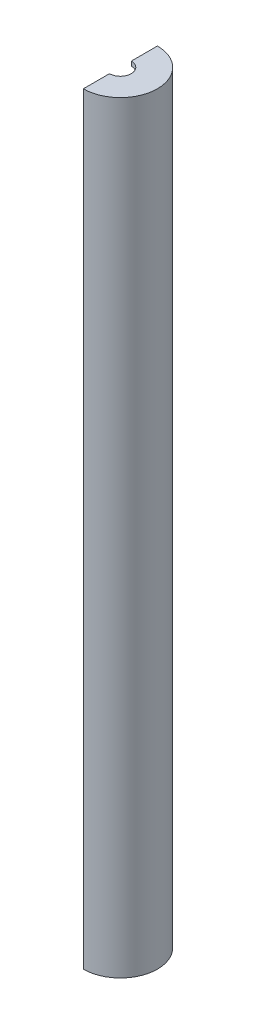
ISO-10303-21;
HEADER;
FILE_DESCRIPTION(('STEP AP214'),'2;1');
FILE_NAME('part.step','',(''),(''),'','','');
FILE_SCHEMA(('AUTOMOTIVE_DESIGN { 1 0 10303 214 1 1 1 1 }'));
ENDSEC;
DATA;
#1=APPLICATION_CONTEXT('core data for automotive mechanical design processes');
#2=APPLICATION_PROTOCOL_DEFINITION('international standard','automotive_design',2000,#1);
#3=PRODUCT_CONTEXT('',#1,'mechanical');
#4=PRODUCT('Part','Part','',(#3));
#5=PRODUCT_RELATED_PRODUCT_CATEGORY('part','',(#4));
#6=PRODUCT_DEFINITION_FORMATION('','',#4);
#7=PRODUCT_DEFINITION_CONTEXT('part definition',#1,'design');
#8=PRODUCT_DEFINITION('design','',#6,#7);
#9=PRODUCT_DEFINITION_SHAPE('','',#8);
#10=(LENGTH_UNIT() NAMED_UNIT(*) SI_UNIT(.MILLI.,.METRE.));
#11=(NAMED_UNIT(*) PLANE_ANGLE_UNIT() SI_UNIT($,.RADIAN.));
#12=(NAMED_UNIT(*) SI_UNIT($,.STERADIAN.) SOLID_ANGLE_UNIT());
#13=UNCERTAINTY_MEASURE_WITH_UNIT(LENGTH_MEASURE(1.E-05),#10,'distance_accuracy_value','');
#14=(GEOMETRIC_REPRESENTATION_CONTEXT(3) GLOBAL_UNCERTAINTY_ASSIGNED_CONTEXT((#13)) GLOBAL_UNIT_ASSIGNED_CONTEXT((#10,
#11,#12)) REPRESENTATION_CONTEXT('',''));
#15=CARTESIAN_POINT('',(0.,0.,0.));
#16=DIRECTION('',(0.,0.,1.));
#17=DIRECTION('',(1.,0.,0.));
#18=AXIS2_PLACEMENT_3D('',#15,#16,#17);
#19=CARTESIAN_POINT('',(0.,350.,0.));
#20=DIRECTION('',(0.,-1.,0.));
#21=DIRECTION('',(0.,0.,-1.));
#22=AXIS2_PLACEMENT_3D('',#19,#20,#21);
#23=CYLINDRICAL_SURFACE('',#22,15.);
#24=CARTESIAN_POINT('',(0.,2.,0.));
#25=DIRECTION('',(0.,-1.,0.));
#26=DIRECTION('',(0.,0.,-1.));
#27=AXIS2_PLACEMENT_3D('',#24,#25,#26);
#28=CIRCLE('',#27,15.);
#29=CARTESIAN_POINT('',(0.,2.,15.));
#30=VERTEX_POINT('',#29);
#31=CARTESIAN_POINT('',(0.,2.,-15.));
#32=VERTEX_POINT('',#31);
#33=EDGE_CURVE('E54',#30,#32,#28,.F.);
#34=ORIENTED_EDGE('',*,*,#33,.F.);
#35=DIRECTION('',(0.,-1.,0.));
#36=VECTOR('',#35,1.);
#37=CARTESIAN_POINT('',(0.,350.,15.));
#38=LINE('',#37,#36);
#39=CARTESIAN_POINT('',(0.,348.,15.));
#40=VERTEX_POINT('',#39);
#41=EDGE_CURVE('E11',#40,#30,#38,.T.);
#42=ORIENTED_EDGE('',*,*,#41,.F.);
#43=CARTESIAN_POINT('',(0.,348.,0.));
#44=DIRECTION('',(0.,1.,0.));
#45=DIRECTION('',(0.,0.,1.));
#46=AXIS2_PLACEMENT_3D('',#43,#44,#45);
#47=CIRCLE('',#46,15.);
#48=CARTESIAN_POINT('',(0.,348.,-15.));
#49=VERTEX_POINT('',#48);
#50=EDGE_CURVE('E159',#49,#40,#47,.F.);
#51=ORIENTED_EDGE('',*,*,#50,.F.);
#52=DIRECTION('',(0.,-1.,0.));
#53=VECTOR('',#52,1.);
#54=CARTESIAN_POINT('',(0.,350.,-15.));
#55=LINE('',#54,#53);
#56=EDGE_CURVE('E58',#49,#32,#55,.T.);
#57=ORIENTED_EDGE('',*,*,#56,.T.);
#58=EDGE_LOOP('',(#34,#42,#51,#57));
#59=FACE_BOUND('',#58,.T.);
#60=ADVANCED_FACE('F39',(#59),#23,.F.);
#61=CARTESIAN_POINT('',(0.,350.,15.));
#62=DIRECTION('',(1.,0.,0.));
#63=DIRECTION('',(0.,0.,-1.));
#64=AXIS2_PLACEMENT_3D('',#61,#62,#63);
#65=PLANE('',#64);
#66=DIRECTION('',(0.,0.,1.));
#67=VECTOR('',#66,1.);
#68=CARTESIAN_POINT('',(0.,0.,15.));
#69=LINE('',#68,#67);
#70=CARTESIAN_POINT('',(0.,0.,5.));
#71=VERTEX_POINT('',#70);
#72=CARTESIAN_POINT('',(0.,0.,17.));
#73=VERTEX_POINT('',#72);
#74=EDGE_CURVE('E165',#71,#73,#69,.T.);
#75=ORIENTED_EDGE('',*,*,#74,.T.);
#76=DIRECTION('',(0.,-1.,0.));
#77=VECTOR('',#76,1.);
#78=CARTESIAN_POINT('',(0.,350.,17.));
#79=LINE('',#78,#77);
#80=CARTESIAN_POINT('',(0.,350.,17.));
#81=VERTEX_POINT('',#80);
#82=EDGE_CURVE('E47',#81,#73,#79,.T.);
#83=ORIENTED_EDGE('',*,*,#82,.F.);
#84=DIRECTION('',(0.,0.,1.));
#85=VECTOR('',#84,1.);
#86=CARTESIAN_POINT('',(0.,350.,15.));
#87=LINE('',#86,#85);
#88=CARTESIAN_POINT('',(0.,350.,5.));
#89=VERTEX_POINT('',#88);
#90=EDGE_CURVE('E166',#89,#81,#87,.T.);
#91=ORIENTED_EDGE('',*,*,#90,.F.);
#92=DIRECTION('',(0.,1.,0.));
#93=VECTOR('',#92,1.);
#94=CARTESIAN_POINT('',(0.,348.,5.));
#95=LINE('',#94,#93);
#96=CARTESIAN_POINT('',(0.,348.,5.));
#97=VERTEX_POINT('',#96);
#98=EDGE_CURVE('E151',#97,#89,#95,.T.);
#99=ORIENTED_EDGE('',*,*,#98,.F.);
#100=DIRECTION('',(0.,0.,1.));
#101=VECTOR('',#100,1.);
#102=CARTESIAN_POINT('',(0.,348.,5.));
#103=LINE('',#102,#101);
#104=EDGE_CURVE('E144',#97,#40,#103,.T.);
#105=ORIENTED_EDGE('',*,*,#104,.T.);
#106=ORIENTED_EDGE('',*,*,#41,.T.);
#107=DIRECTION('',(0.,0.,-1.));
#108=VECTOR('',#107,1.);
#109=CARTESIAN_POINT('',(0.,2.,17.));
#110=LINE('',#109,#108);
#111=CARTESIAN_POINT('',(0.,2.,5.));
#112=VERTEX_POINT('',#111);
#113=EDGE_CURVE('E115',#30,#112,#110,.T.);
#114=ORIENTED_EDGE('',*,*,#113,.T.);
#115=DIRECTION('',(0.,-1.,0.));
#116=VECTOR('',#115,1.);
#117=CARTESIAN_POINT('',(0.,2.,5.));
#118=LINE('',#117,#116);
#119=EDGE_CURVE('E114',#112,#71,#118,.T.);
#120=ORIENTED_EDGE('',*,*,#119,.T.);
#121=EDGE_LOOP('',(#75,#83,#91,#99,#105,#106,#114,#120));
#122=FACE_BOUND('',#121,.T.);
#123=ADVANCED_FACE('F196',(#122),#65,.F.);
#124=CARTESIAN_POINT('',(0.,350.,0.));
#125=DIRECTION('',(0.,-1.,0.));
#126=DIRECTION('',(0.,0.,-1.));
#127=AXIS2_PLACEMENT_3D('',#124,#125,#126);
#128=CYLINDRICAL_SURFACE('',#127,17.);
#129=CARTESIAN_POINT('',(0.,0.,0.));
#130=DIRECTION('',(0.,1.,0.));
#131=DIRECTION('',(0.,0.,1.));
#132=AXIS2_PLACEMENT_3D('',#129,#130,#131);
#133=CIRCLE('',#132,17.);
#134=CARTESIAN_POINT('',(0.,0.,-17.));
#135=VERTEX_POINT('',#134);
#136=EDGE_CURVE('E178',#73,#135,#133,.T.);
#137=ORIENTED_EDGE('',*,*,#136,.T.);
#138=DIRECTION('',(0.,-1.,0.));
#139=VECTOR('',#138,1.);
#140=CARTESIAN_POINT('',(0.,350.,-17.));
#141=LINE('',#140,#139);
#142=CARTESIAN_POINT('',(0.,350.,-17.));
#143=VERTEX_POINT('',#142);
#144=EDGE_CURVE('E186',#143,#135,#141,.T.);
#145=ORIENTED_EDGE('',*,*,#144,.F.);
#146=CARTESIAN_POINT('',(0.,350.,0.));
#147=DIRECTION('',(0.,1.,0.));
#148=DIRECTION('',(0.,0.,1.));
#149=AXIS2_PLACEMENT_3D('',#146,#147,#148);
#150=CIRCLE('',#149,17.);
#151=EDGE_CURVE('E169',#81,#143,#150,.T.);
#152=ORIENTED_EDGE('',*,*,#151,.F.);
#153=ORIENTED_EDGE('',*,*,#82,.T.);
#154=EDGE_LOOP('',(#137,#145,#152,#153));
#155=FACE_BOUND('',#154,.T.);
#156=ADVANCED_FACE('F192',(#155),#128,.T.);
#157=CARTESIAN_POINT('',(0.,350.,-17.));
#158=DIRECTION('',(1.,0.,0.));
#159=DIRECTION('',(0.,0.,-1.));
#160=AXIS2_PLACEMENT_3D('',#157,#158,#159);
#161=PLANE('',#160);
#162=DIRECTION('',(0.,0.,1.));
#163=VECTOR('',#162,1.);
#164=CARTESIAN_POINT('',(0.,0.,-17.));
#165=LINE('',#164,#163);
#166=CARTESIAN_POINT('',(0.,0.,-5.));
#167=VERTEX_POINT('',#166);
#168=EDGE_CURVE('E108',#135,#167,#165,.T.);
#169=ORIENTED_EDGE('',*,*,#168,.T.);
#170=DIRECTION('',(0.,-1.,0.));
#171=VECTOR('',#170,1.);
#172=CARTESIAN_POINT('',(0.,2.,-5.));
#173=LINE('',#172,#171);
#174=CARTESIAN_POINT('',(0.,2.,-5.));
#175=VERTEX_POINT('',#174);
#176=EDGE_CURVE('E103',#175,#167,#173,.T.);
#177=ORIENTED_EDGE('',*,*,#176,.F.);
#178=DIRECTION('',(0.,0.,-1.));
#179=VECTOR('',#178,1.);
#180=CARTESIAN_POINT('',(0.,2.,-5.));
#181=LINE('',#180,#179);
#182=EDGE_CURVE('E106',#175,#32,#181,.T.);
#183=ORIENTED_EDGE('',*,*,#182,.T.);
#184=ORIENTED_EDGE('',*,*,#56,.F.);
#185=DIRECTION('',(0.,0.,1.));
#186=VECTOR('',#185,1.);
#187=CARTESIAN_POINT('',(0.,348.,-17.));
#188=LINE('',#187,#186);
#189=CARTESIAN_POINT('',(0.,348.,-5.));
#190=VERTEX_POINT('',#189);
#191=EDGE_CURVE('E148',#49,#190,#188,.T.);
#192=ORIENTED_EDGE('',*,*,#191,.T.);
#193=DIRECTION('',(0.,1.,0.));
#194=VECTOR('',#193,1.);
#195=CARTESIAN_POINT('',(0.,348.,-5.));
#196=LINE('',#195,#194);
#197=CARTESIAN_POINT('',(0.,350.,-5.));
#198=VERTEX_POINT('',#197);
#199=EDGE_CURVE('E155',#190,#198,#196,.T.);
#200=ORIENTED_EDGE('',*,*,#199,.T.);
#201=DIRECTION('',(0.,0.,1.));
#202=VECTOR('',#201,1.);
#203=CARTESIAN_POINT('',(0.,350.,-17.));
#204=LINE('',#203,#202);
#205=EDGE_CURVE('E172',#143,#198,#204,.T.);
#206=ORIENTED_EDGE('',*,*,#205,.F.);
#207=ORIENTED_EDGE('',*,*,#144,.T.);
#208=EDGE_LOOP('',(#169,#177,#183,#184,#192,#200,#206,#207));
#209=FACE_BOUND('',#208,.T.);
#210=ADVANCED_FACE('F105',(#209),#161,.F.);
#211=CARTESIAN_POINT('',(0.,350.,0.));
#212=DIRECTION('',(0.,1.,0.));
#213=DIRECTION('',(0.,0.,1.));
#214=AXIS2_PLACEMENT_3D('',#211,#212,#213);
#215=PLANE('',#214);
#216=ORIENTED_EDGE('',*,*,#205,.T.);
#217=CARTESIAN_POINT('',(0.,350.,0.));
#218=DIRECTION('',(0.,-1.,0.));
#219=DIRECTION('',(0.,0.,1.));
#220=AXIS2_PLACEMENT_3D('',#217,#218,#219);
#221=CIRCLE('',#220,5.);
#222=EDGE_CURVE('E139',#198,#89,#221,.T.);
#223=ORIENTED_EDGE('',*,*,#222,.T.);
#224=ORIENTED_EDGE('',*,*,#90,.T.);
#225=ORIENTED_EDGE('',*,*,#151,.T.);
#226=EDGE_LOOP('',(#216,#223,#224,#225));
#227=FACE_BOUND('',#226,.T.);
#228=ADVANCED_FACE('F201',(#227),#215,.T.);
#229=CARTESIAN_POINT('',(0.,0.,0.));
#230=DIRECTION('',(0.,1.,0.));
#231=DIRECTION('',(0.,0.,1.));
#232=AXIS2_PLACEMENT_3D('',#229,#230,#231);
#233=PLANE('',#232);
#234=ORIENTED_EDGE('',*,*,#74,.F.);
#235=CARTESIAN_POINT('',(0.,0.,0.));
#236=DIRECTION('',(0.,1.,0.));
#237=DIRECTION('',(0.,0.,-1.));
#238=AXIS2_PLACEMENT_3D('',#235,#236,#237);
#239=CIRCLE('',#238,5.);
#240=EDGE_CURVE('E128',#71,#167,#239,.T.);
#241=ORIENTED_EDGE('',*,*,#240,.T.);
#242=ORIENTED_EDGE('',*,*,#168,.F.);
#243=ORIENTED_EDGE('',*,*,#136,.F.);
#244=EDGE_LOOP('',(#234,#241,#242,#243));
#245=FACE_BOUND('',#244,.T.);
#246=ADVANCED_FACE('F198',(#245),#233,.F.);
#247=CARTESIAN_POINT('',(0.,348.,0.));
#248=DIRECTION('',(0.,1.,0.));
#249=DIRECTION('',(0.,0.,1.));
#250=AXIS2_PLACEMENT_3D('',#247,#248,#249);
#251=PLANE('',#250);
#252=ORIENTED_EDGE('',*,*,#191,.F.);
#253=ORIENTED_EDGE('',*,*,#50,.T.);
#254=ORIENTED_EDGE('',*,*,#104,.F.);
#255=CARTESIAN_POINT('',(0.,348.,0.));
#256=DIRECTION('',(0.,-1.,0.));
#257=DIRECTION('',(0.,0.,1.));
#258=AXIS2_PLACEMENT_3D('',#255,#256,#257);
#259=CIRCLE('',#258,5.);
#260=EDGE_CURVE('E140',#190,#97,#259,.T.);
#261=ORIENTED_EDGE('',*,*,#260,.F.);
#262=EDGE_LOOP('',(#252,#253,#254,#261));
#263=FACE_BOUND('',#262,.T.);
#264=ADVANCED_FACE('F200',(#263),#251,.F.);
#265=CARTESIAN_POINT('',(0.,348.,0.));
#266=DIRECTION('',(0.,1.,0.));
#267=DIRECTION('',(0.,0.,1.));
#268=AXIS2_PLACEMENT_3D('',#265,#266,#267);
#269=CYLINDRICAL_SURFACE('',#268,5.);
#270=ORIENTED_EDGE('',*,*,#222,.F.);
#271=ORIENTED_EDGE('',*,*,#199,.F.);
#272=ORIENTED_EDGE('',*,*,#260,.T.);
#273=ORIENTED_EDGE('',*,*,#98,.T.);
#274=EDGE_LOOP('',(#270,#271,#272,#273));
#275=FACE_BOUND('',#274,.T.);
#276=ADVANCED_FACE('F207',(#275),#269,.F.);
#277=CARTESIAN_POINT('',(0.,2.,0.));
#278=DIRECTION('',(0.,-1.,0.));
#279=DIRECTION('',(0.,0.,-1.));
#280=AXIS2_PLACEMENT_3D('',#277,#278,#279);
#281=PLANE('',#280);
#282=ORIENTED_EDGE('',*,*,#113,.F.);
#283=ORIENTED_EDGE('',*,*,#33,.T.);
#284=ORIENTED_EDGE('',*,*,#182,.F.);
#285=CARTESIAN_POINT('',(0.,2.,0.));
#286=DIRECTION('',(0.,1.,0.));
#287=DIRECTION('',(0.,0.,-1.));
#288=AXIS2_PLACEMENT_3D('',#285,#286,#287);
#289=CIRCLE('',#288,5.);
#290=EDGE_CURVE('E121',#112,#175,#289,.T.);
#291=ORIENTED_EDGE('',*,*,#290,.F.);
#292=EDGE_LOOP('',(#282,#283,#284,#291));
#293=FACE_BOUND('',#292,.T.);
#294=ADVANCED_FACE('F120',(#293),#281,.F.);
#295=CARTESIAN_POINT('',(0.,2.,0.));
#296=DIRECTION('',(0.,-1.,0.));
#297=DIRECTION('',(0.,0.,-1.));
#298=AXIS2_PLACEMENT_3D('',#295,#296,#297);
#299=CYLINDRICAL_SURFACE('',#298,5.);
#300=ORIENTED_EDGE('',*,*,#240,.F.);
#301=ORIENTED_EDGE('',*,*,#119,.F.);
#302=ORIENTED_EDGE('',*,*,#290,.T.);
#303=ORIENTED_EDGE('',*,*,#176,.T.);
#304=EDGE_LOOP('',(#300,#301,#302,#303));
#305=FACE_BOUND('',#304,.T.);
#306=ADVANCED_FACE('F125',(#305),#299,.F.);
#307=CLOSED_SHELL('',(#60,#123,#156,#210,#228,#246,#264,#276,#294,#306));
#308=MANIFOLD_SOLID_BREP('B2',#307);
#309=ADVANCED_BREP_SHAPE_REPRESENTATION('',(#18,#308),#14);
#310=SHAPE_DEFINITION_REPRESENTATION(#9,#309);
ENDSEC;
END-ISO-10303-21;
